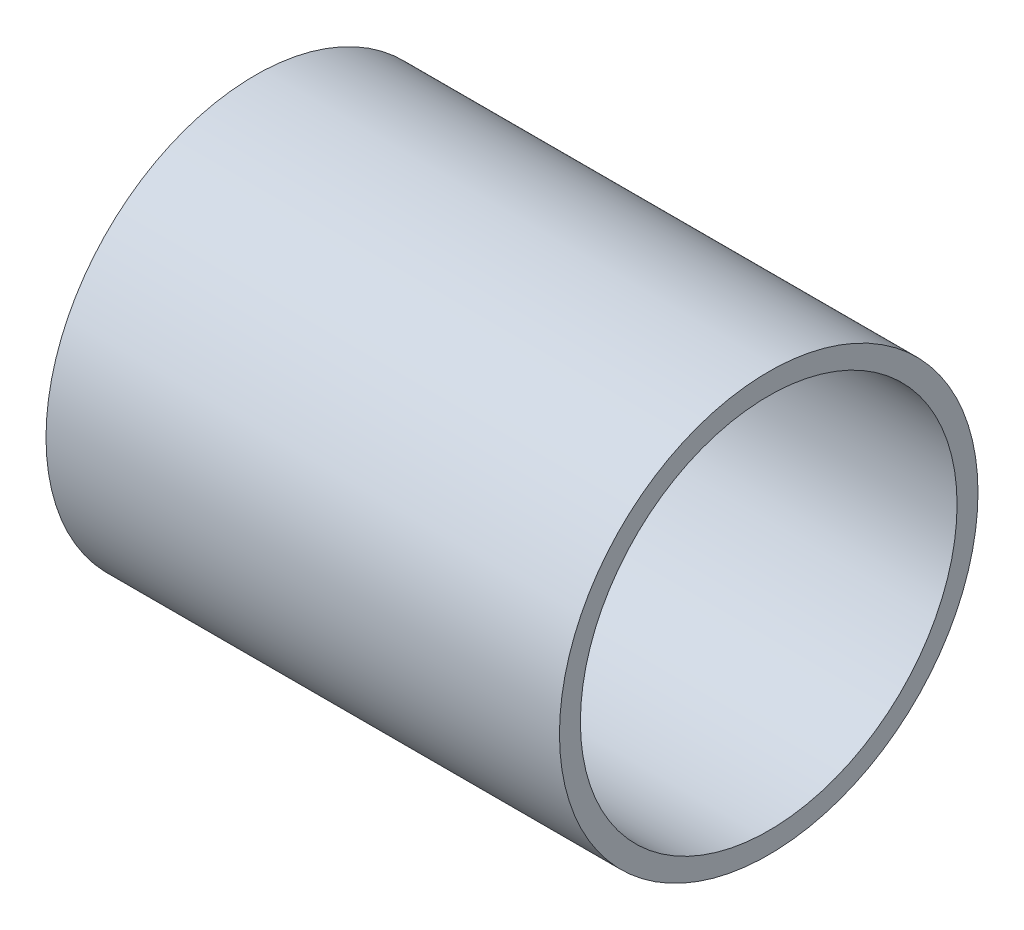
ISO-10303-21;
HEADER;
FILE_DESCRIPTION(('STEP AP214'),'2;1');
FILE_NAME('part.step','',(''),(''),'','','');
FILE_SCHEMA(('AUTOMOTIVE_DESIGN { 1 0 10303 214 1 1 1 1 }'));
ENDSEC;
DATA;
#1=APPLICATION_CONTEXT('core data for automotive mechanical design processes');
#2=APPLICATION_PROTOCOL_DEFINITION('international standard','automotive_design',2000,#1);
#3=PRODUCT_CONTEXT('',#1,'mechanical');
#4=PRODUCT('Part','Part','',(#3));
#5=PRODUCT_RELATED_PRODUCT_CATEGORY('part','',(#4));
#6=PRODUCT_DEFINITION_FORMATION('','',#4);
#7=PRODUCT_DEFINITION_CONTEXT('part definition',#1,'design');
#8=PRODUCT_DEFINITION('design','',#6,#7);
#9=PRODUCT_DEFINITION_SHAPE('','',#8);
#10=(LENGTH_UNIT() NAMED_UNIT(*) SI_UNIT(.MILLI.,.METRE.));
#11=(NAMED_UNIT(*) PLANE_ANGLE_UNIT() SI_UNIT($,.RADIAN.));
#12=(NAMED_UNIT(*) SI_UNIT($,.STERADIAN.) SOLID_ANGLE_UNIT());
#13=UNCERTAINTY_MEASURE_WITH_UNIT(LENGTH_MEASURE(1.E-05),#10,'distance_accuracy_value','');
#14=(GEOMETRIC_REPRESENTATION_CONTEXT(3) GLOBAL_UNCERTAINTY_ASSIGNED_CONTEXT((#13)) GLOBAL_UNIT_ASSIGNED_CONTEXT((#10,
#11,#12)) REPRESENTATION_CONTEXT('',''));
#15=CARTESIAN_POINT('',(0.,0.,0.));
#16=DIRECTION('',(0.,0.,1.));
#17=DIRECTION('',(1.,0.,0.));
#18=AXIS2_PLACEMENT_3D('',#15,#16,#17);
#19=CARTESIAN_POINT('',(167.4495,0.,0.));
#20=DIRECTION('',(-1.,0.,0.));
#21=DIRECTION('',(0.,0.,1.));
#22=AXIS2_PLACEMENT_3D('',#19,#20,#21);
#23=CYLINDRICAL_SURFACE('',#22,14.2875);
#24=CARTESIAN_POINT('',(165.1254,0.,0.));
#25=DIRECTION('',(-1.,0.,0.));
#26=DIRECTION('',(0.,0.,1.));
#27=AXIS2_PLACEMENT_3D('',#24,#25,#26);
#28=CIRCLE('',#27,14.2875);
#29=CARTESIAN_POINT('',(165.1254,0.,14.2875));
#30=VERTEX_POINT('',#29);
#31=EDGE_CURVE('E47',#30,#30,#28,.T.);
#32=ORIENTED_EDGE('',*,*,#31,.F.);
#33=EDGE_LOOP('',(#32));
#34=FACE_BOUND('',#33,.T.);
#35=CARTESIAN_POINT('',(126.1745,0.,0.));
#36=DIRECTION('',(1.,0.,0.));
#37=DIRECTION('',(0.,0.,-1.));
#38=AXIS2_PLACEMENT_3D('',#35,#36,#37);
#39=CIRCLE('',#38,14.2875);
#40=CARTESIAN_POINT('',(126.1745,0.,-14.2875));
#41=VERTEX_POINT('',#40);
#42=EDGE_CURVE('E51',#41,#41,#39,.T.);
#43=ORIENTED_EDGE('',*,*,#42,.F.);
#44=EDGE_LOOP('',(#43));
#45=FACE_BOUND('',#44,.T.);
#46=ADVANCED_FACE('F36',(#34,#45),#23,.F.);
#47=CARTESIAN_POINT('',(126.1745,-15.875,-15.875));
#48=DIRECTION('',(1.,0.,0.));
#49=DIRECTION('',(0.,0.,-1.));
#50=AXIS2_PLACEMENT_3D('',#47,#48,#49);
#51=PLANE('',#50);
#52=ORIENTED_EDGE('',*,*,#42,.T.);
#53=EDGE_LOOP('',(#52));
#54=FACE_BOUND('',#53,.T.);
#55=CARTESIAN_POINT('',(126.1745,0.,0.));
#56=DIRECTION('',(1.,0.,0.));
#57=DIRECTION('',(0.,0.,-1.));
#58=AXIS2_PLACEMENT_3D('',#55,#56,#57);
#59=CIRCLE('',#58,15.875);
#60=CARTESIAN_POINT('',(126.1745,0.,-15.875));
#61=VERTEX_POINT('',#60);
#62=EDGE_CURVE('E10',#61,#61,#59,.T.);
#63=ORIENTED_EDGE('',*,*,#62,.F.);
#64=EDGE_LOOP('',(#63));
#65=FACE_BOUND('',#64,.T.);
#66=ADVANCED_FACE('F57',(#54,#65),#51,.F.);
#67=CARTESIAN_POINT('',(165.1254,-15.875,-15.875));
#68=DIRECTION('',(-1.,0.,0.));
#69=DIRECTION('',(0.,0.,1.));
#70=AXIS2_PLACEMENT_3D('',#67,#68,#69);
#71=PLANE('',#70);
#72=ORIENTED_EDGE('',*,*,#31,.T.);
#73=EDGE_LOOP('',(#72));
#74=FACE_BOUND('',#73,.T.);
#75=CARTESIAN_POINT('',(165.1254,0.,0.));
#76=DIRECTION('',(-1.,0.,0.));
#77=DIRECTION('',(0.,0.,1.));
#78=AXIS2_PLACEMENT_3D('',#75,#76,#77);
#79=CIRCLE('',#78,15.875);
#80=CARTESIAN_POINT('',(165.1254,0.,15.875));
#81=VERTEX_POINT('',#80);
#82=EDGE_CURVE('E43',#81,#81,#79,.T.);
#83=ORIENTED_EDGE('',*,*,#82,.F.);
#84=EDGE_LOOP('',(#83));
#85=FACE_BOUND('',#84,.T.);
#86=ADVANCED_FACE('F65',(#74,#85),#71,.F.);
#87=CARTESIAN_POINT('',(167.4495,0.,0.));
#88=DIRECTION('',(-1.,0.,0.));
#89=DIRECTION('',(0.,0.,1.));
#90=AXIS2_PLACEMENT_3D('',#87,#88,#89);
#91=CYLINDRICAL_SURFACE('',#90,15.875);
#92=ORIENTED_EDGE('',*,*,#82,.T.);
#93=EDGE_LOOP('',(#92));
#94=FACE_BOUND('',#93,.T.);
#95=ORIENTED_EDGE('',*,*,#62,.T.);
#96=EDGE_LOOP('',(#95));
#97=FACE_BOUND('',#96,.T.);
#98=ADVANCED_FACE('F38',(#94,#97),#91,.T.);
#99=CLOSED_SHELL('',(#46,#66,#86,#98));
#100=MANIFOLD_SOLID_BREP('B2',#99);
#101=ADVANCED_BREP_SHAPE_REPRESENTATION('',(#18,#100),#14);
#102=SHAPE_DEFINITION_REPRESENTATION(#9,#101);
ENDSEC;
END-ISO-10303-21;
